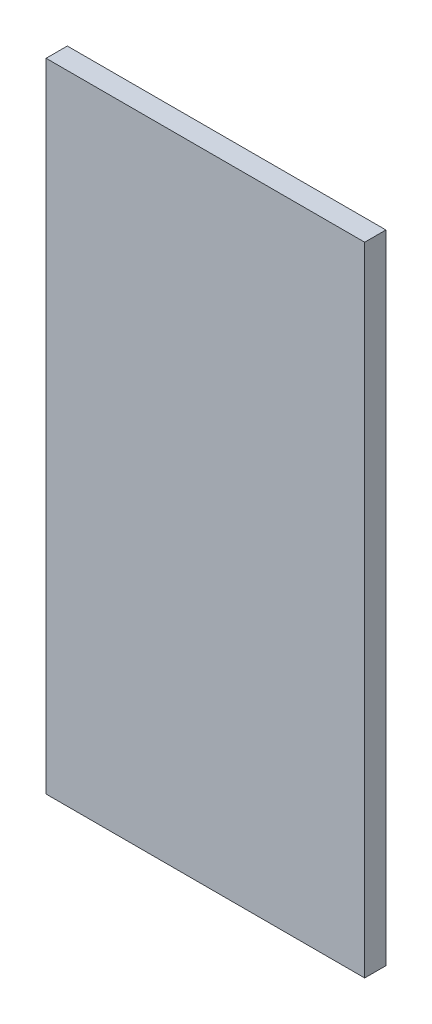
ISO-10303-21;
HEADER;
FILE_DESCRIPTION(('STEP AP214'),'2;1');
FILE_NAME('part.step','',(''),(''),'','','');
FILE_SCHEMA(('AUTOMOTIVE_DESIGN { 1 0 10303 214 1 1 1 1 }'));
ENDSEC;
DATA;
#1=APPLICATION_CONTEXT('core data for automotive mechanical design processes');
#2=APPLICATION_PROTOCOL_DEFINITION('international standard','automotive_design',2000,#1);
#3=PRODUCT_CONTEXT('',#1,'mechanical');
#4=PRODUCT('Part','Part','',(#3));
#5=PRODUCT_RELATED_PRODUCT_CATEGORY('part','',(#4));
#6=PRODUCT_DEFINITION_FORMATION('','',#4);
#7=PRODUCT_DEFINITION_CONTEXT('part definition',#1,'design');
#8=PRODUCT_DEFINITION('design','',#6,#7);
#9=PRODUCT_DEFINITION_SHAPE('','',#8);
#10=(LENGTH_UNIT() NAMED_UNIT(*) SI_UNIT(.MILLI.,.METRE.));
#11=(NAMED_UNIT(*) PLANE_ANGLE_UNIT() SI_UNIT($,.RADIAN.));
#12=(NAMED_UNIT(*) SI_UNIT($,.STERADIAN.) SOLID_ANGLE_UNIT());
#13=UNCERTAINTY_MEASURE_WITH_UNIT(LENGTH_MEASURE(1.E-05),#10,'distance_accuracy_value','');
#14=(GEOMETRIC_REPRESENTATION_CONTEXT(3) GLOBAL_UNCERTAINTY_ASSIGNED_CONTEXT((#13)) GLOBAL_UNIT_ASSIGNED_CONTEXT((#10,
#11,#12)) REPRESENTATION_CONTEXT('',''));
#15=CARTESIAN_POINT('',(0.,0.,0.));
#16=DIRECTION('',(0.,0.,1.));
#17=DIRECTION('',(1.,0.,0.));
#18=AXIS2_PLACEMENT_3D('',#15,#16,#17);
#19=CARTESIAN_POINT('',(-82.7540929834526,167.834413861943,350.));
#20=DIRECTION('',(1.,0.,0.));
#21=DIRECTION('',(0.,1.,0.));
#22=AXIS2_PLACEMENT_3D('',#19,#20,#21);
#23=PLANE('',#22);
#24=DIRECTION('',(0.,1.,0.));
#25=VECTOR('',#24,1.);
#26=CARTESIAN_POINT('',(-82.7540929834526,167.834413861943,360.));
#27=LINE('',#26,#25);
#28=CARTESIAN_POINT('',(-82.7540929834526,-132.165586138057,360.));
#29=VERTEX_POINT('',#28);
#30=CARTESIAN_POINT('',(-82.7540929834526,167.834413861943,360.));
#31=VERTEX_POINT('',#30);
#32=EDGE_CURVE('E96',#29,#31,#27,.T.);
#33=ORIENTED_EDGE('',*,*,#32,.T.);
#34=DIRECTION('',(0.,0.,1.));
#35=VECTOR('',#34,1.);
#36=CARTESIAN_POINT('',(-82.7540929834526,167.834413861943,350.));
#37=LINE('',#36,#35);
#38=CARTESIAN_POINT('',(-82.7540929834526,167.834413861943,350.));
#39=VERTEX_POINT('',#38);
#40=EDGE_CURVE('E11',#39,#31,#37,.T.);
#41=ORIENTED_EDGE('',*,*,#40,.F.);
#42=DIRECTION('',(0.,1.,0.));
#43=VECTOR('',#42,1.);
#44=CARTESIAN_POINT('',(-82.7540929834526,167.834413861943,350.));
#45=LINE('',#44,#43);
#46=CARTESIAN_POINT('',(-82.7540929834526,-132.165586138057,350.));
#47=VERTEX_POINT('',#46);
#48=EDGE_CURVE('E84',#47,#39,#45,.T.);
#49=ORIENTED_EDGE('',*,*,#48,.F.);
#50=DIRECTION('',(0.,0.,1.));
#51=VECTOR('',#50,1.);
#52=CARTESIAN_POINT('',(-82.7540929834526,-132.165586138057,350.));
#53=LINE('',#52,#51);
#54=EDGE_CURVE('E92',#47,#29,#53,.T.);
#55=ORIENTED_EDGE('',*,*,#54,.T.);
#56=EDGE_LOOP('',(#33,#41,#49,#55));
#57=FACE_BOUND('',#56,.T.);
#58=ADVANCED_FACE('F33',(#57),#23,.F.);
#59=CARTESIAN_POINT('',(67.2459070165474,167.834413861943,350.));
#60=DIRECTION('',(0.,-1.,0.));
#61=DIRECTION('',(0.,0.,-1.));
#62=AXIS2_PLACEMENT_3D('',#59,#60,#61);
#63=PLANE('',#62);
#64=DIRECTION('',(1.,0.,0.));
#65=VECTOR('',#64,1.);
#66=CARTESIAN_POINT('',(67.2459070165474,167.834413861943,360.));
#67=LINE('',#66,#65);
#68=CARTESIAN_POINT('',(67.2459070165474,167.834413861943,360.));
#69=VERTEX_POINT('',#68);
#70=EDGE_CURVE('E88',#31,#69,#67,.T.);
#71=ORIENTED_EDGE('',*,*,#70,.T.);
#72=DIRECTION('',(0.,0.,1.));
#73=VECTOR('',#72,1.);
#74=CARTESIAN_POINT('',(67.2459070165474,167.834413861943,350.));
#75=LINE('',#74,#73);
#76=CARTESIAN_POINT('',(67.2459070165474,167.834413861943,350.));
#77=VERTEX_POINT('',#76);
#78=EDGE_CURVE('E41',#77,#69,#75,.T.);
#79=ORIENTED_EDGE('',*,*,#78,.F.);
#80=DIRECTION('',(1.,0.,0.));
#81=VECTOR('',#80,1.);
#82=CARTESIAN_POINT('',(67.2459070165474,167.834413861943,350.));
#83=LINE('',#82,#81);
#84=EDGE_CURVE('E79',#39,#77,#83,.T.);
#85=ORIENTED_EDGE('',*,*,#84,.F.);
#86=ORIENTED_EDGE('',*,*,#40,.T.);
#87=EDGE_LOOP('',(#71,#79,#85,#86));
#88=FACE_BOUND('',#87,.T.);
#89=ADVANCED_FACE('F87',(#88),#63,.F.);
#90=CARTESIAN_POINT('',(67.2459070165474,167.834413861943,350.));
#91=DIRECTION('',(-1.,0.,0.));
#92=DIRECTION('',(0.,0.,1.));
#93=AXIS2_PLACEMENT_3D('',#90,#91,#92);
#94=PLANE('',#93);
#95=DIRECTION('',(0.,-1.,0.));
#96=VECTOR('',#95,1.);
#97=CARTESIAN_POINT('',(67.2459070165474,167.834413861943,360.));
#98=LINE('',#97,#96);
#99=CARTESIAN_POINT('',(67.2459070165474,-132.165586138057,360.));
#100=VERTEX_POINT('',#99);
#101=EDGE_CURVE('E66',#69,#100,#98,.T.);
#102=ORIENTED_EDGE('',*,*,#101,.T.);
#103=DIRECTION('',(0.,0.,1.));
#104=VECTOR('',#103,1.);
#105=CARTESIAN_POINT('',(67.2459070165474,-132.165586138057,350.));
#106=LINE('',#105,#104);
#107=CARTESIAN_POINT('',(67.2459070165474,-132.165586138057,350.));
#108=VERTEX_POINT('',#107);
#109=EDGE_CURVE('E89',#108,#100,#106,.T.);
#110=ORIENTED_EDGE('',*,*,#109,.F.);
#111=DIRECTION('',(0.,-1.,0.));
#112=VECTOR('',#111,1.);
#113=CARTESIAN_POINT('',(67.2459070165474,167.834413861943,350.));
#114=LINE('',#113,#112);
#115=EDGE_CURVE('E82',#77,#108,#114,.T.);
#116=ORIENTED_EDGE('',*,*,#115,.F.);
#117=ORIENTED_EDGE('',*,*,#78,.T.);
#118=EDGE_LOOP('',(#102,#110,#116,#117));
#119=FACE_BOUND('',#118,.T.);
#120=ADVANCED_FACE('F90',(#119),#94,.F.);
#121=CARTESIAN_POINT('',(67.2459070165474,-132.165586138057,350.));
#122=DIRECTION('',(0.,1.,0.));
#123=DIRECTION('',(0.,0.,1.));
#124=AXIS2_PLACEMENT_3D('',#121,#122,#123);
#125=PLANE('',#124);
#126=DIRECTION('',(-1.,0.,0.));
#127=VECTOR('',#126,1.);
#128=CARTESIAN_POINT('',(67.2459070165474,-132.165586138057,360.));
#129=LINE('',#128,#127);
#130=EDGE_CURVE('E72',#100,#29,#129,.T.);
#131=ORIENTED_EDGE('',*,*,#130,.T.);
#132=ORIENTED_EDGE('',*,*,#54,.F.);
#133=DIRECTION('',(-1.,0.,0.));
#134=VECTOR('',#133,1.);
#135=CARTESIAN_POINT('',(67.2459070165474,-132.165586138057,350.));
#136=LINE('',#135,#134);
#137=EDGE_CURVE('E49',#108,#47,#136,.T.);
#138=ORIENTED_EDGE('',*,*,#137,.F.);
#139=ORIENTED_EDGE('',*,*,#109,.T.);
#140=EDGE_LOOP('',(#131,#132,#138,#139));
#141=FACE_BOUND('',#140,.T.);
#142=ADVANCED_FACE('F103',(#141),#125,.F.);
#143=CARTESIAN_POINT('',(0.,0.,350.));
#144=DIRECTION('',(0.,0.,-1.));
#145=DIRECTION('',(-1.,0.,0.));
#146=AXIS2_PLACEMENT_3D('',#143,#144,#145);
#147=PLANE('',#146);
#148=ORIENTED_EDGE('',*,*,#48,.T.);
#149=ORIENTED_EDGE('',*,*,#84,.T.);
#150=ORIENTED_EDGE('',*,*,#115,.T.);
#151=ORIENTED_EDGE('',*,*,#137,.T.);
#152=EDGE_LOOP('',(#148,#149,#150,#151));
#153=FACE_BOUND('',#152,.T.);
#154=ADVANCED_FACE('F80',(#153),#147,.T.);
#155=CARTESIAN_POINT('',(0.,0.,360.));
#156=DIRECTION('',(0.,0.,-1.));
#157=DIRECTION('',(-1.,0.,0.));
#158=AXIS2_PLACEMENT_3D('',#155,#156,#157);
#159=PLANE('',#158);
#160=ORIENTED_EDGE('',*,*,#32,.F.);
#161=ORIENTED_EDGE('',*,*,#130,.F.);
#162=ORIENTED_EDGE('',*,*,#101,.F.);
#163=ORIENTED_EDGE('',*,*,#70,.F.);
#164=EDGE_LOOP('',(#160,#161,#162,#163));
#165=FACE_BOUND('',#164,.T.);
#166=ADVANCED_FACE('F106',(#165),#159,.F.);
#167=CLOSED_SHELL('',(#58,#89,#120,#142,#154,#166));
#168=MANIFOLD_SOLID_BREP('B2',#167);
#169=ADVANCED_BREP_SHAPE_REPRESENTATION('',(#18,#168),#14);
#170=SHAPE_DEFINITION_REPRESENTATION(#9,#169);
ENDSEC;
END-ISO-10303-21;
